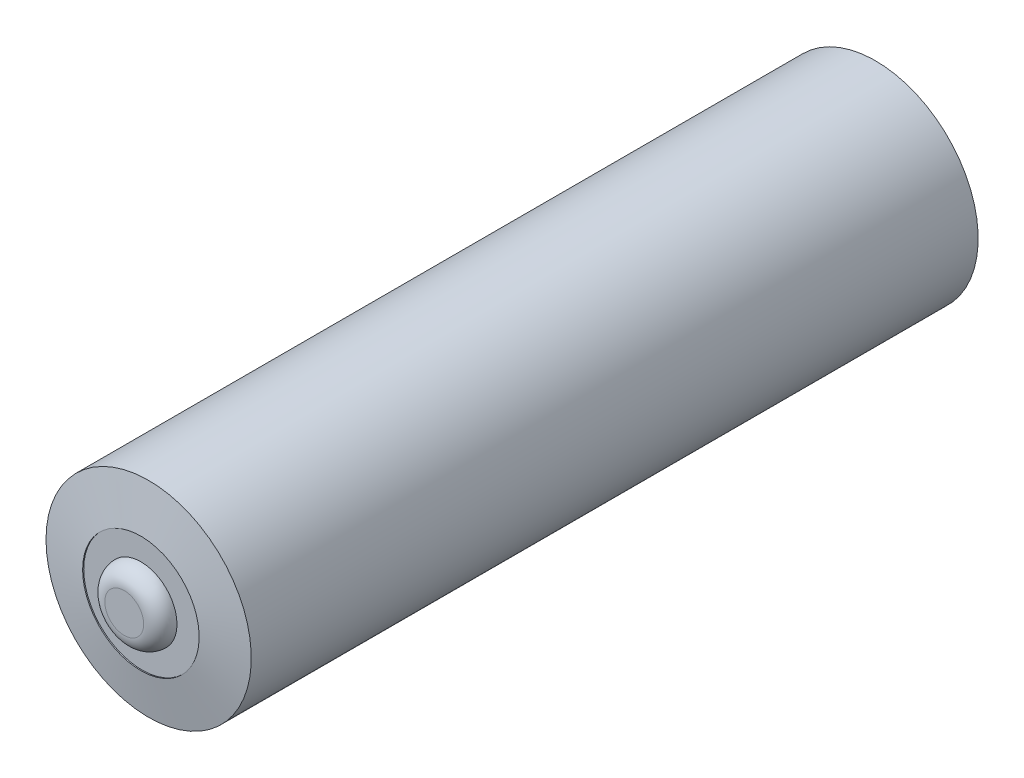
ISO-10303-21;
HEADER;
FILE_DESCRIPTION(('STEP AP214'),'2;1');
FILE_NAME('part.step','',(''),(''),'','','');
FILE_SCHEMA(('AUTOMOTIVE_DESIGN { 1 0 10303 214 1 1 1 1 }'));
ENDSEC;
DATA;
#1=APPLICATION_CONTEXT('core data for automotive mechanical design processes');
#2=APPLICATION_PROTOCOL_DEFINITION('international standard','automotive_design',2000,#1);
#3=PRODUCT_CONTEXT('',#1,'mechanical');
#4=PRODUCT('Part','Part','',(#3));
#5=PRODUCT_RELATED_PRODUCT_CATEGORY('part','',(#4));
#6=PRODUCT_DEFINITION_FORMATION('','',#4);
#7=PRODUCT_DEFINITION_CONTEXT('part definition',#1,'design');
#8=PRODUCT_DEFINITION('design','',#6,#7);
#9=PRODUCT_DEFINITION_SHAPE('','',#8);
#10=(LENGTH_UNIT() NAMED_UNIT(*) SI_UNIT(.MILLI.,.METRE.));
#11=(NAMED_UNIT(*) PLANE_ANGLE_UNIT() SI_UNIT($,.RADIAN.));
#12=(NAMED_UNIT(*) SI_UNIT($,.STERADIAN.) SOLID_ANGLE_UNIT());
#13=UNCERTAINTY_MEASURE_WITH_UNIT(LENGTH_MEASURE(1.E-05),#10,'distance_accuracy_value','');
#14=(GEOMETRIC_REPRESENTATION_CONTEXT(3) GLOBAL_UNCERTAINTY_ASSIGNED_CONTEXT((#13)) GLOBAL_UNIT_ASSIGNED_CONTEXT((#10,
#11,#12)) REPRESENTATION_CONTEXT('',''));
#15=CARTESIAN_POINT('',(0.,0.,0.));
#16=DIRECTION('',(0.,0.,1.));
#17=DIRECTION('',(1.,0.,0.));
#18=AXIS2_PLACEMENT_3D('',#15,#16,#17);
#19=CARTESIAN_POINT('',(0.,0.,0.));
#20=DIRECTION('',(0.,0.,1.));
#21=DIRECTION('',(1.,0.,0.));
#22=AXIS2_PLACEMENT_3D('',#19,#20,#21);
#23=PLANE('',#22);
#24=CARTESIAN_POINT('',(0.,0.,0.));
#25=DIRECTION('',(0.,0.,1.));
#26=DIRECTION('',(1.,0.,0.));
#27=AXIS2_PLACEMENT_3D('',#24,#25,#26);
#28=CIRCLE('',#27,5.25);
#29=CARTESIAN_POINT('',(-5.25,0.,0.));
#30=VERTEX_POINT('',#29);
#31=EDGE_CURVE('P0_E66',#30,#30,#28,.T.);
#32=ORIENTED_EDGE('',*,*,#31,.T.);
#33=EDGE_LOOP('',(#32));
#34=FACE_BOUND('',#33,.T.);
#35=CARTESIAN_POINT('',(0.,0.,0.));
#36=DIRECTION('',(0.,0.,1.));
#37=DIRECTION('',(1.,0.,0.));
#38=AXIS2_PLACEMENT_3D('',#35,#36,#37);
#39=CIRCLE('',#38,9.25);
#40=CARTESIAN_POINT('',(-9.25,0.,0.));
#41=VERTEX_POINT('',#40);
#42=EDGE_CURVE('P0_E10',#41,#41,#39,.T.);
#43=ORIENTED_EDGE('',*,*,#42,.F.);
#44=EDGE_LOOP('',(#43));
#45=FACE_BOUND('',#44,.T.);
#46=ADVANCED_FACE('P0_F16',(#34,#45),#23,.F.);
#47=CARTESIAN_POINT('',(0.,0.,0.));
#48=DIRECTION('',(0.,0.,1.));
#49=DIRECTION('',(1.,0.,0.));
#50=AXIS2_PLACEMENT_3D('',#47,#48,#49);
#51=CYLINDRICAL_SURFACE('',#50,9.25);
#52=CARTESIAN_POINT('',(0.,0.,65.5));
#53=DIRECTION('',(0.,0.,1.));
#54=DIRECTION('',(1.,0.,0.));
#55=AXIS2_PLACEMENT_3D('',#52,#53,#54);
#56=CIRCLE('',#55,9.25);
#57=CARTESIAN_POINT('',(-9.25,0.,65.5));
#58=VERTEX_POINT('',#57);
#59=EDGE_CURVE('P0_E55',#58,#58,#56,.T.);
#60=ORIENTED_EDGE('',*,*,#59,.F.);
#61=DIRECTION('',(0.,0.,-1.));
#62=VECTOR('',#61,1.);
#63=CARTESIAN_POINT('',(-9.25,0.,0.));
#64=LINE('',#63,#62);
#65=EDGE_CURVE('P0_E26',#58,#41,#64,.T.);
#66=ORIENTED_EDGE('',*,*,#65,.T.);
#67=ORIENTED_EDGE('',*,*,#42,.T.);
#68=ORIENTED_EDGE('',*,*,#65,.F.);
#69=EDGE_LOOP('',(#60,#66,#67,#68));
#70=FACE_BOUND('',#69,.T.);
#71=ADVANCED_FACE('P0_F18',(#70),#51,.T.);
#72=CARTESIAN_POINT('',(0.,0.,0.2));
#73=DIRECTION('',(0.,0.,1.));
#74=DIRECTION('',(1.,0.,0.));
#75=AXIS2_PLACEMENT_3D('',#72,#73,#74);
#76=PLANE('',#75);
#77=CARTESIAN_POINT('',(0.,0.,0.2));
#78=DIRECTION('',(0.,0.,1.));
#79=DIRECTION('',(1.,0.,0.));
#80=AXIS2_PLACEMENT_3D('',#77,#78,#79);
#81=CIRCLE('',#80,5.25);
#82=CARTESIAN_POINT('',(-5.25,0.,0.2));
#83=VERTEX_POINT('',#82);
#84=EDGE_CURVE('P0_E58',#83,#83,#81,.T.);
#85=ORIENTED_EDGE('',*,*,#84,.F.);
#86=EDGE_LOOP('',(#85));
#87=FACE_BOUND('',#86,.T.);
#88=ADVANCED_FACE('P0_F89',(#87),#76,.F.);
#89=CARTESIAN_POINT('',(0.,0.,0.));
#90=DIRECTION('',(0.,0.,1.));
#91=DIRECTION('',(1.,0.,0.));
#92=AXIS2_PLACEMENT_3D('',#89,#90,#91);
#93=CYLINDRICAL_SURFACE('',#92,5.25);
#94=ORIENTED_EDGE('',*,*,#31,.F.);
#95=DIRECTION('',(0.,0.,1.));
#96=VECTOR('',#95,1.);
#97=CARTESIAN_POINT('',(-5.25,0.,0.));
#98=LINE('',#97,#96);
#99=EDGE_CURVE('P0_E74',#30,#83,#98,.T.);
#100=ORIENTED_EDGE('',*,*,#99,.T.);
#101=ORIENTED_EDGE('',*,*,#84,.T.);
#102=ORIENTED_EDGE('',*,*,#99,.F.);
#103=EDGE_LOOP('',(#94,#100,#101,#102));
#104=FACE_BOUND('',#103,.T.);
#105=ADVANCED_FACE('P0_F87',(#104),#93,.F.);
#106=CARTESIAN_POINT('',(0.,0.,65.5));
#107=DIRECTION('',(0.,0.,-1.));
#108=DIRECTION('',(1.,0.,0.));
#109=AXIS2_PLACEMENT_3D('',#106,#107,#108);
#110=CONICAL_SURFACE('',#109,9.25,1.39755066034253);
#111=CARTESIAN_POINT('',(0.,0.,66.2));
#112=DIRECTION('',(0.,0.,-1.));
#113=DIRECTION('',(1.,0.,0.));
#114=AXIS2_PLACEMENT_3D('',#111,#112,#113);
#115=CIRCLE('',#114,5.25);
#116=CARTESIAN_POINT('',(-5.25,0.,66.2));
#117=VERTEX_POINT('',#116);
#118=EDGE_CURVE('P0_E124',#117,#117,#115,.T.);
#119=ORIENTED_EDGE('',*,*,#118,.T.);
#120=DIRECTION('',(-0.985030467155704,0.,-0.172380331752249));
#121=VECTOR('',#120,1.);
#122=CARTESIAN_POINT('',(-9.25,0.,65.5));
#123=LINE('',#122,#121);
#124=EDGE_CURVE('P0_E63',#117,#58,#123,.T.);
#125=ORIENTED_EDGE('',*,*,#124,.T.);
#126=ORIENTED_EDGE('',*,*,#59,.T.);
#127=ORIENTED_EDGE('',*,*,#124,.F.);
#128=EDGE_LOOP('',(#119,#125,#126,#127));
#129=FACE_BOUND('',#128,.T.);
#130=ADVANCED_FACE('P0_F62',(#129),#110,.T.);
#131=CARTESIAN_POINT('',(0.,0.,66.1));
#132=DIRECTION('',(0.,0.,1.));
#133=DIRECTION('',(1.,0.,0.));
#134=AXIS2_PLACEMENT_3D('',#131,#132,#133);
#135=PLANE('',#134);
#136=CARTESIAN_POINT('',(0.,0.,66.1));
#137=DIRECTION('',(0.,0.,-1.));
#138=DIRECTION('',(1.,0.,0.));
#139=AXIS2_PLACEMENT_3D('',#136,#137,#138);
#140=CIRCLE('',#139,5.25);
#141=CARTESIAN_POINT('',(-5.25,0.,66.1));
#142=VERTEX_POINT('',#141);
#143=EDGE_CURVE('P0_E76',#142,#142,#140,.T.);
#144=ORIENTED_EDGE('',*,*,#143,.F.);
#145=EDGE_LOOP('',(#144));
#146=FACE_BOUND('',#145,.T.);
#147=ADVANCED_FACE('P0_F107',(#146),#135,.T.);
#148=CARTESIAN_POINT('',(0.,0.,66.2));
#149=DIRECTION('',(0.,0.,-1.));
#150=DIRECTION('',(1.,0.,0.));
#151=AXIS2_PLACEMENT_3D('',#148,#149,#150);
#152=CYLINDRICAL_SURFACE('',#151,5.25);
#153=ORIENTED_EDGE('',*,*,#118,.F.);
#154=DIRECTION('',(0.,0.,-1.));
#155=VECTOR('',#154,1.);
#156=CARTESIAN_POINT('',(-5.25,0.,66.2));
#157=LINE('',#156,#155);
#158=EDGE_CURVE('P0_E121',#117,#142,#157,.T.);
#159=ORIENTED_EDGE('',*,*,#158,.T.);
#160=ORIENTED_EDGE('',*,*,#143,.T.);
#161=ORIENTED_EDGE('',*,*,#158,.F.);
#162=EDGE_LOOP('',(#153,#159,#160,#161));
#163=FACE_BOUND('',#162,.T.);
#164=ADVANCED_FACE('P0_F113',(#163),#152,.F.);
#165=CLOSED_SHELL('',(#46,#71,#88,#105,#130,#147,#164));
#166=MANIFOLD_SOLID_BREP('P0_B1',#165);
#167=CARTESIAN_POINT('',(0.,0.,66.2));
#168=DIRECTION('',(0.,0.,1.));
#169=DIRECTION('',(1.,0.,0.));
#170=AXIS2_PLACEMENT_3D('',#167,#168,#169);
#171=PLANE('',#170);
#172=CARTESIAN_POINT('',(0.,0.,66.2));
#173=DIRECTION('',(0.,0.,1.));
#174=DIRECTION('',(1.,0.,0.));
#175=AXIS2_PLACEMENT_3D('',#172,#173,#174);
#176=CIRCLE('',#175,3.25);
#177=CARTESIAN_POINT('',(-3.25,0.,66.2));
#178=VERTEX_POINT('',#177);
#179=EDGE_CURVE('P1_E10',#178,#178,#176,.T.);
#180=ORIENTED_EDGE('',*,*,#179,.F.);
#181=EDGE_LOOP('',(#180));
#182=FACE_BOUND('',#181,.T.);
#183=ADVANCED_FACE('P1_F16',(#182),#171,.F.);
#184=CARTESIAN_POINT('',(0.,0.,67.7));
#185=DIRECTION('',(0.,0.,1.));
#186=DIRECTION('',(1.,0.,0.));
#187=AXIS2_PLACEMENT_3D('',#184,#185,#186);
#188=PLANE('',#187);
#189=CARTESIAN_POINT('',(0.,0.,67.7));
#190=DIRECTION('',(0.,0.,-1.));
#191=DIRECTION('',(1.,0.,0.));
#192=AXIS2_PLACEMENT_3D('',#189,#190,#191);
#193=CIRCLE('',#192,1.75);
#194=CARTESIAN_POINT('',(-1.75,0.,67.7));
#195=VERTEX_POINT('',#194);
#196=EDGE_CURVE('P1_E40',#195,#195,#193,.T.);
#197=ORIENTED_EDGE('',*,*,#196,.F.);
#198=EDGE_LOOP('',(#197));
#199=FACE_BOUND('',#198,.T.);
#200=ADVANCED_FACE('P1_F64',(#199),#188,.T.);
#201=CARTESIAN_POINT('',(0.,0.,66.2));
#202=DIRECTION('',(0.,0.,1.));
#203=DIRECTION('',(1.,0.,0.));
#204=AXIS2_PLACEMENT_3D('',#201,#202,#203);
#205=TOROIDAL_SURFACE('',#204,1.75,1.5);
#206=ORIENTED_EDGE('',*,*,#196,.T.);
#207=CARTESIAN_POINT('',(-1.75,0.,66.2));
#208=DIRECTION('',(0.,-1.,0.));
#209=DIRECTION('',(-1.,0.,0.));
#210=AXIS2_PLACEMENT_3D('',#207,#208,#209);
#211=CIRCLE('',#210,1.5);
#212=EDGE_CURVE('P1_E24',#195,#178,#211,.T.);
#213=ORIENTED_EDGE('',*,*,#212,.T.);
#214=ORIENTED_EDGE('',*,*,#179,.T.);
#215=ORIENTED_EDGE('',*,*,#212,.F.);
#216=EDGE_LOOP('',(#206,#213,#214,#215));
#217=FACE_BOUND('',#216,.T.);
#218=ADVANCED_FACE('P1_F38',(#217),#205,.T.);
#219=CLOSED_SHELL('',(#183,#200,#218));
#220=MANIFOLD_SOLID_BREP('P1_B1',#219);
#221=ADVANCED_BREP_SHAPE_REPRESENTATION('',(#18,#166,#220),#14);
#222=SHAPE_DEFINITION_REPRESENTATION(#9,#221);
ENDSEC;
END-ISO-10303-21;
